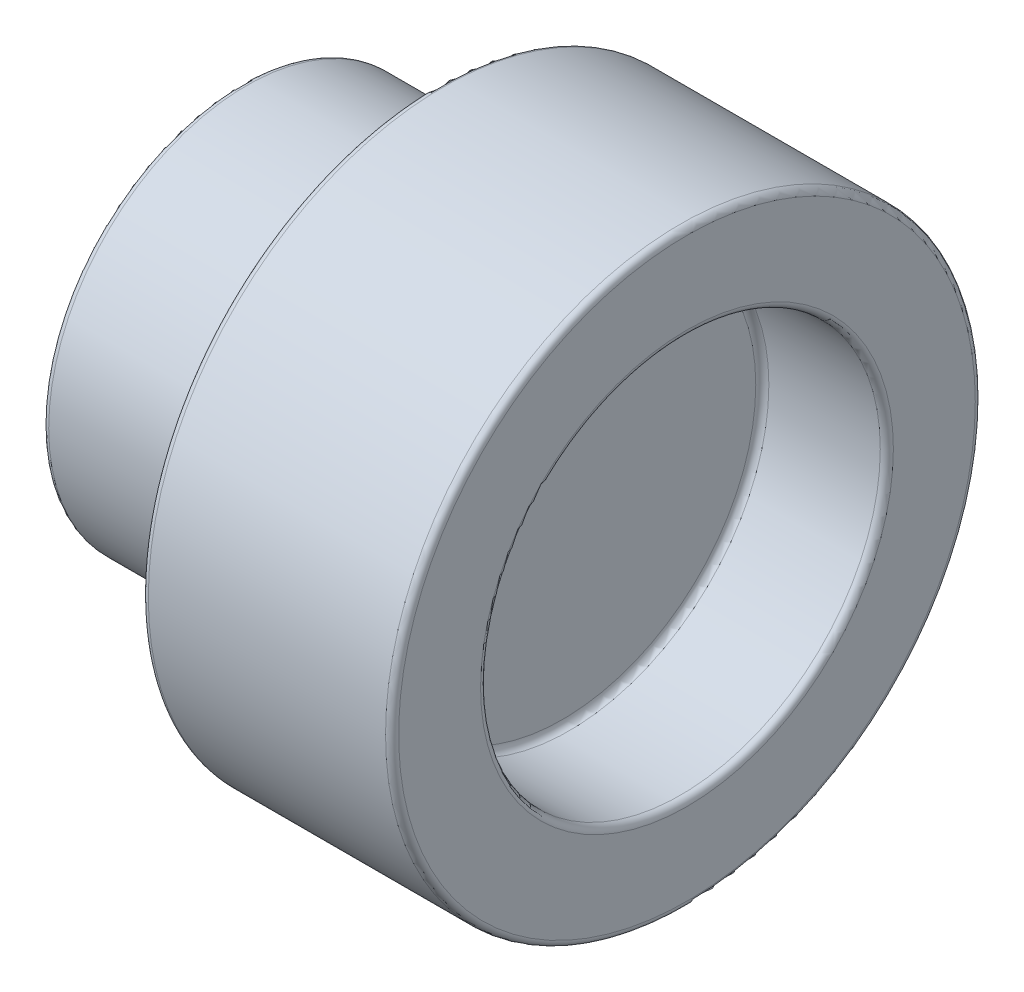
ISO-10303-21;
HEADER;
FILE_DESCRIPTION(('STEP AP214'),'2;1');
FILE_NAME('part.step','',(''),(''),'','','');
FILE_SCHEMA(('AUTOMOTIVE_DESIGN { 1 0 10303 214 1 1 1 1 }'));
ENDSEC;
DATA;
#1=APPLICATION_CONTEXT('core data for automotive mechanical design processes');
#2=APPLICATION_PROTOCOL_DEFINITION('international standard','automotive_design',2000,#1);
#3=PRODUCT_CONTEXT('',#1,'mechanical');
#4=PRODUCT('Part','Part','',(#3));
#5=PRODUCT_RELATED_PRODUCT_CATEGORY('part','',(#4));
#6=PRODUCT_DEFINITION_FORMATION('','',#4);
#7=PRODUCT_DEFINITION_CONTEXT('part definition',#1,'design');
#8=PRODUCT_DEFINITION('design','',#6,#7);
#9=PRODUCT_DEFINITION_SHAPE('','',#8);
#10=(LENGTH_UNIT() NAMED_UNIT(*) SI_UNIT(.MILLI.,.METRE.));
#11=(NAMED_UNIT(*) PLANE_ANGLE_UNIT() SI_UNIT($,.RADIAN.));
#12=(NAMED_UNIT(*) SI_UNIT($,.STERADIAN.) SOLID_ANGLE_UNIT());
#13=UNCERTAINTY_MEASURE_WITH_UNIT(LENGTH_MEASURE(1.E-05),#10,'distance_accuracy_value','');
#14=(GEOMETRIC_REPRESENTATION_CONTEXT(3) GLOBAL_UNCERTAINTY_ASSIGNED_CONTEXT((#13)) GLOBAL_UNIT_ASSIGNED_CONTEXT((#10,
#11,#12)) REPRESENTATION_CONTEXT('',''));
#15=CARTESIAN_POINT('',(0.,0.,0.));
#16=DIRECTION('',(0.,0.,1.));
#17=DIRECTION('',(1.,0.,0.));
#18=AXIS2_PLACEMENT_3D('',#15,#16,#17);
#19=CARTESIAN_POINT('',(3.82,0.,0.));
#20=DIRECTION('',(1.,0.,0.));
#21=DIRECTION('',(0.,0.,-1.));
#22=AXIS2_PLACEMENT_3D('',#19,#20,#21);
#23=PLANE('',#22);
#24=CARTESIAN_POINT('',(3.82,0.,0.));
#25=DIRECTION('',(1.,0.,0.));
#26=DIRECTION('',(0.,0.,-1.));
#27=AXIS2_PLACEMENT_3D('',#24,#25,#26);
#28=CIRCLE('',#27,3.15);
#29=CARTESIAN_POINT('',(3.82,0.,-3.15));
#30=VERTEX_POINT('',#29);
#31=EDGE_CURVE('E65',#30,#30,#28,.F.);
#32=ORIENTED_EDGE('',*,*,#31,.T.);
#33=EDGE_LOOP('',(#32));
#34=FACE_BOUND('',#33,.T.);
#35=CARTESIAN_POINT('',(3.82,0.,0.));
#36=DIRECTION('',(1.,0.,0.));
#37=DIRECTION('',(0.,0.,-1.));
#38=AXIS2_PLACEMENT_3D('',#35,#36,#37);
#39=CIRCLE('',#38,4.4);
#40=CARTESIAN_POINT('',(3.82,0.,-4.4));
#41=VERTEX_POINT('',#40);
#42=EDGE_CURVE('E68',#41,#41,#39,.T.);
#43=ORIENTED_EDGE('',*,*,#42,.T.);
#44=EDGE_LOOP('',(#43));
#45=FACE_BOUND('',#44,.T.);
#46=ADVANCED_FACE('F42',(#34,#45),#23,.T.);
#47=CARTESIAN_POINT('',(0.,0.,0.));
#48=DIRECTION('',(1.,0.,0.));
#49=DIRECTION('',(0.,0.,-1.));
#50=AXIS2_PLACEMENT_3D('',#47,#48,#49);
#51=PLANE('',#50);
#52=CARTESIAN_POINT('',(0.,0.,0.));
#53=DIRECTION('',(1.,0.,0.));
#54=DIRECTION('',(0.,0.,-1.));
#55=AXIS2_PLACEMENT_3D('',#52,#53,#54);
#56=CIRCLE('',#55,4.4);
#57=CARTESIAN_POINT('',(0.,0.,-4.4));
#58=VERTEX_POINT('',#57);
#59=EDGE_CURVE('E53',#58,#58,#56,.F.);
#60=ORIENTED_EDGE('',*,*,#59,.T.);
#61=EDGE_LOOP('',(#60));
#62=FACE_BOUND('',#61,.T.);
#63=CARTESIAN_POINT('',(0.,0.,0.));
#64=DIRECTION('',(1.,0.,0.));
#65=DIRECTION('',(0.,0.,-1.));
#66=AXIS2_PLACEMENT_3D('',#63,#64,#65);
#67=CIRCLE('',#66,3.05);
#68=CARTESIAN_POINT('',(0.,0.,-3.05));
#69=VERTEX_POINT('',#68);
#70=EDGE_CURVE('E83',#69,#69,#67,.F.);
#71=ORIENTED_EDGE('',*,*,#70,.F.);
#72=EDGE_LOOP('',(#71));
#73=FACE_BOUND('',#72,.T.);
#74=ADVANCED_FACE('F90',(#62,#73),#51,.F.);
#75=CARTESIAN_POINT('',(3.82,0.,0.));
#76=DIRECTION('',(-1.,0.,0.));
#77=DIRECTION('',(0.,0.,1.));
#78=AXIS2_PLACEMENT_3D('',#75,#76,#77);
#79=CYLINDRICAL_SURFACE('',#78,4.5);
#80=CARTESIAN_POINT('',(0.0999999999999998,0.,0.));
#81=DIRECTION('',(1.,0.,0.));
#82=DIRECTION('',(0.,0.,-1.));
#83=AXIS2_PLACEMENT_3D('',#80,#81,#82);
#84=CIRCLE('',#83,4.5);
#85=CARTESIAN_POINT('',(0.0999999999999994,0.,4.5));
#86=VERTEX_POINT('',#85);
#87=EDGE_CURVE('E57',#86,#86,#84,.T.);
#88=CARTESIAN_POINT('',(3.72,0.,0.));
#89=DIRECTION('',(1.,0.,0.));
#90=DIRECTION('',(0.,0.,-1.));
#91=AXIS2_PLACEMENT_3D('',#88,#89,#90);
#92=CIRCLE('',#91,4.5);
#93=CARTESIAN_POINT('',(3.72,0.,4.5));
#94=VERTEX_POINT('',#93);
#95=EDGE_CURVE('E62',#94,#94,#92,.F.);
#96=CARTESIAN_POINT('',(0.0999999999999994,0.,4.5));
#97=CARTESIAN_POINT('',(0.137708333333333,0.,4.5));
#98=CARTESIAN_POINT('',(0.175416666666666,0.,4.5));
#99=CARTESIAN_POINT('',(0.250833333333333,0.,4.5));
#100=CARTESIAN_POINT('',(0.288541666666666,0.,4.5));
#101=CARTESIAN_POINT('',(0.363958333333333,0.,4.5));
#102=CARTESIAN_POINT('',(0.401666666666666,0.,4.5));
#103=CARTESIAN_POINT('',(0.477083333333333,0.,4.5));
#104=CARTESIAN_POINT('',(0.514791666666666,0.,4.5));
#105=CARTESIAN_POINT('',(0.590208333333333,0.,4.5));
#106=CARTESIAN_POINT('',(0.627916666666666,0.,4.5));
#107=CARTESIAN_POINT('',(0.703333333333333,0.,4.5));
#108=CARTESIAN_POINT('',(0.741041666666666,0.,4.5));
#109=CARTESIAN_POINT('',(0.816458333333333,0.,4.5));
#110=CARTESIAN_POINT('',(0.854166666666666,0.,4.5));
#111=CARTESIAN_POINT('',(0.929583333333333,0.,4.5));
#112=CARTESIAN_POINT('',(0.967291666666666,0.,4.5));
#113=CARTESIAN_POINT('',(1.04270833333333,0.,4.5));
#114=CARTESIAN_POINT('',(1.08041666666667,0.,4.5));
#115=CARTESIAN_POINT('',(1.15583333333333,0.,4.5));
#116=CARTESIAN_POINT('',(1.19354166666667,0.,4.5));
#117=CARTESIAN_POINT('',(1.26895833333333,0.,4.5));
#118=CARTESIAN_POINT('',(1.30666666666667,0.,4.5));
#119=CARTESIAN_POINT('',(1.38208333333333,0.,4.5));
#120=CARTESIAN_POINT('',(1.41979166666667,0.,4.5));
#121=CARTESIAN_POINT('',(1.49520833333333,0.,4.5));
#122=CARTESIAN_POINT('',(1.53291666666667,0.,4.5));
#123=CARTESIAN_POINT('',(1.60833333333333,0.,4.5));
#124=CARTESIAN_POINT('',(1.64604166666667,0.,4.5));
#125=CARTESIAN_POINT('',(1.72145833333333,0.,4.5));
#126=CARTESIAN_POINT('',(1.75916666666667,0.,4.5));
#127=CARTESIAN_POINT('',(1.83458333333333,0.,4.5));
#128=CARTESIAN_POINT('',(1.87229166666667,0.,4.5));
#129=CARTESIAN_POINT('',(1.94770833333333,0.,4.5));
#130=CARTESIAN_POINT('',(1.98541666666667,0.,4.5));
#131=CARTESIAN_POINT('',(2.06083333333333,0.,4.5));
#132=CARTESIAN_POINT('',(2.09854166666667,0.,4.5));
#133=CARTESIAN_POINT('',(2.17395833333333,0.,4.5));
#134=CARTESIAN_POINT('',(2.21166666666667,0.,4.5));
#135=CARTESIAN_POINT('',(2.28708333333333,0.,4.5));
#136=CARTESIAN_POINT('',(2.32479166666667,0.,4.5));
#137=CARTESIAN_POINT('',(2.40020833333333,0.,4.5));
#138=CARTESIAN_POINT('',(2.43791666666667,0.,4.5));
#139=CARTESIAN_POINT('',(2.51333333333333,0.,4.5));
#140=CARTESIAN_POINT('',(2.55104166666667,0.,4.5));
#141=CARTESIAN_POINT('',(2.62645833333333,0.,4.5));
#142=CARTESIAN_POINT('',(2.66416666666667,0.,4.5));
#143=CARTESIAN_POINT('',(2.73958333333333,0.,4.5));
#144=CARTESIAN_POINT('',(2.77729166666667,0.,4.5));
#145=CARTESIAN_POINT('',(2.85270833333333,0.,4.5));
#146=CARTESIAN_POINT('',(2.89041666666667,0.,4.5));
#147=CARTESIAN_POINT('',(2.96583333333333,0.,4.5));
#148=CARTESIAN_POINT('',(3.00354166666667,0.,4.5));
#149=CARTESIAN_POINT('',(3.07895833333333,0.,4.5));
#150=CARTESIAN_POINT('',(3.11666666666667,0.,4.5));
#151=CARTESIAN_POINT('',(3.19208333333333,0.,4.5));
#152=CARTESIAN_POINT('',(3.22979166666667,0.,4.5));
#153=CARTESIAN_POINT('',(3.30520833333333,0.,4.5));
#154=CARTESIAN_POINT('',(3.34291666666667,0.,4.5));
#155=CARTESIAN_POINT('',(3.41833333333333,0.,4.5));
#156=CARTESIAN_POINT('',(3.45604166666667,0.,4.5));
#157=CARTESIAN_POINT('',(3.53145833333333,0.,4.5));
#158=CARTESIAN_POINT('',(3.56916666666667,0.,4.5));
#159=CARTESIAN_POINT('',(3.64458333333333,0.,4.5));
#160=CARTESIAN_POINT('',(3.68229166666667,0.,4.5));
#161=CARTESIAN_POINT('',(3.72,0.,4.5));
#162=B_SPLINE_CURVE_WITH_KNOTS('',3,(#96,#97,#98,#99,#100,#101,#102,#103,#104,#105,#106,#107,
#108,#109,#110,#111,#112,#113,#114,#115,#116,#117,#118,#119,#120,#121,#122,#123,#124,#125,#126,
#127,#128,#129,#130,#131,#132,#133,#134,#135,#136,#137,#138,#139,#140,#141,#142,#143,#144,#145,
#146,#147,#148,#149,#150,#151,#152,#153,#154,#155,#156,#157,#158,#159,#160,#161),.UNSPECIFIED.,
.F.,.F.,(4,2,2,2,2,2,2,2,2,2,2,2,2,2,2,2,2,2,2,2,2,2,2,2,2,2,2,2,2,2,2,2,4),(0.,0.113125,
0.22625,0.339375,0.4525,0.565625,0.67875,0.791875,0.905,1.018125,1.13125,1.244375,1.3575,
1.470625,1.58375,1.696875,1.81,1.923125,2.03625,2.149375,2.2625,2.375625,2.48875,2.601875,2.715,
2.828125,2.94125,3.054375,3.1675,3.280625,3.39375,3.506875,3.62),.UNSPECIFIED.);
#163=EDGE_CURVE('BSEAM92',#86,#94,#162,.T.);
#164=ORIENTED_EDGE('',*,*,#87,.T.);
#165=ORIENTED_EDGE('',*,*,#95,.T.);
#166=ORIENTED_EDGE('',*,*,#163,.T.);
#167=ORIENTED_EDGE('',*,*,#163,.F.);
#168=EDGE_LOOP('',(#164,#166,#165,#167));
#169=FACE_BOUND('',#168,.T.);
#170=ADVANCED_FACE('F92',(#169),#79,.T.);
#171=CARTESIAN_POINT('',(3.82,0.,0.));
#172=DIRECTION('',(-1.,0.,0.));
#173=DIRECTION('',(0.,0.,1.));
#174=AXIS2_PLACEMENT_3D('',#171,#172,#173);
#175=CYLINDRICAL_SURFACE('',#174,3.05);
#176=CARTESIAN_POINT('',(2.02,0.,0.));
#177=DIRECTION('',(1.,0.,0.));
#178=DIRECTION('',(0.,0.,-1.));
#179=AXIS2_PLACEMENT_3D('',#176,#177,#178);
#180=CIRCLE('',#179,3.05);
#181=CARTESIAN_POINT('',(2.02,0.,3.05));
#182=VERTEX_POINT('',#181);
#183=EDGE_CURVE('E11',#182,#182,#180,.F.);
#184=CARTESIAN_POINT('',(3.72,0.,0.));
#185=DIRECTION('',(1.,0.,0.));
#186=DIRECTION('',(0.,0.,-1.));
#187=AXIS2_PLACEMENT_3D('',#184,#185,#186);
#188=CIRCLE('',#187,3.05);
#189=CARTESIAN_POINT('',(3.72,0.,3.05));
#190=VERTEX_POINT('',#189);
#191=EDGE_CURVE('E71',#190,#190,#188,.T.);
#192=CARTESIAN_POINT('',(2.02,0.,3.05));
#193=CARTESIAN_POINT('',(2.03770833333333,0.,3.05));
#194=CARTESIAN_POINT('',(2.05541666666667,0.,3.05));
#195=CARTESIAN_POINT('',(2.09083333333333,0.,3.05));
#196=CARTESIAN_POINT('',(2.10854166666667,0.,3.05));
#197=CARTESIAN_POINT('',(2.14395833333333,0.,3.05));
#198=CARTESIAN_POINT('',(2.16166666666667,0.,3.05));
#199=CARTESIAN_POINT('',(2.19708333333333,0.,3.05));
#200=CARTESIAN_POINT('',(2.21479166666667,0.,3.05));
#201=CARTESIAN_POINT('',(2.25020833333333,0.,3.05));
#202=CARTESIAN_POINT('',(2.26791666666667,0.,3.05));
#203=CARTESIAN_POINT('',(2.30333333333333,0.,3.05));
#204=CARTESIAN_POINT('',(2.32104166666667,0.,3.05));
#205=CARTESIAN_POINT('',(2.35645833333333,0.,3.05));
#206=CARTESIAN_POINT('',(2.37416666666667,0.,3.05));
#207=CARTESIAN_POINT('',(2.40958333333333,0.,3.05));
#208=CARTESIAN_POINT('',(2.42729166666667,0.,3.05));
#209=CARTESIAN_POINT('',(2.46270833333333,0.,3.05));
#210=CARTESIAN_POINT('',(2.48041666666667,0.,3.05));
#211=CARTESIAN_POINT('',(2.51583333333333,0.,3.05));
#212=CARTESIAN_POINT('',(2.53354166666667,0.,3.05));
#213=CARTESIAN_POINT('',(2.56895833333333,0.,3.05));
#214=CARTESIAN_POINT('',(2.58666666666667,0.,3.05));
#215=CARTESIAN_POINT('',(2.62208333333333,0.,3.05));
#216=CARTESIAN_POINT('',(2.63979166666667,0.,3.05));
#217=CARTESIAN_POINT('',(2.67520833333333,0.,3.05));
#218=CARTESIAN_POINT('',(2.69291666666667,0.,3.05));
#219=CARTESIAN_POINT('',(2.72833333333333,0.,3.05));
#220=CARTESIAN_POINT('',(2.74604166666667,0.,3.05));
#221=CARTESIAN_POINT('',(2.78145833333333,0.,3.05));
#222=CARTESIAN_POINT('',(2.79916666666667,0.,3.05));
#223=CARTESIAN_POINT('',(2.83458333333333,0.,3.05));
#224=CARTESIAN_POINT('',(2.85229166666667,0.,3.05));
#225=CARTESIAN_POINT('',(2.88770833333333,0.,3.05));
#226=CARTESIAN_POINT('',(2.90541666666667,0.,3.05));
#227=CARTESIAN_POINT('',(2.94083333333333,0.,3.05));
#228=CARTESIAN_POINT('',(2.95854166666667,0.,3.05));
#229=CARTESIAN_POINT('',(2.99395833333333,0.,3.05));
#230=CARTESIAN_POINT('',(3.01166666666667,0.,3.05));
#231=CARTESIAN_POINT('',(3.04708333333333,0.,3.05));
#232=CARTESIAN_POINT('',(3.06479166666667,0.,3.05));
#233=CARTESIAN_POINT('',(3.10020833333333,0.,3.05));
#234=CARTESIAN_POINT('',(3.11791666666667,0.,3.05));
#235=CARTESIAN_POINT('',(3.15333333333333,0.,3.05));
#236=CARTESIAN_POINT('',(3.17104166666667,0.,3.05));
#237=CARTESIAN_POINT('',(3.20645833333333,0.,3.05));
#238=CARTESIAN_POINT('',(3.22416666666667,0.,3.05));
#239=CARTESIAN_POINT('',(3.25958333333333,0.,3.05));
#240=CARTESIAN_POINT('',(3.27729166666667,0.,3.05));
#241=CARTESIAN_POINT('',(3.31270833333333,0.,3.05));
#242=CARTESIAN_POINT('',(3.33041666666667,0.,3.05));
#243=CARTESIAN_POINT('',(3.36583333333333,0.,3.05));
#244=CARTESIAN_POINT('',(3.38354166666667,0.,3.05));
#245=CARTESIAN_POINT('',(3.41895833333333,0.,3.05));
#246=CARTESIAN_POINT('',(3.43666666666667,0.,3.05));
#247=CARTESIAN_POINT('',(3.47208333333333,0.,3.05));
#248=CARTESIAN_POINT('',(3.48979166666667,0.,3.05));
#249=CARTESIAN_POINT('',(3.52520833333333,0.,3.05));
#250=CARTESIAN_POINT('',(3.54291666666667,0.,3.05));
#251=CARTESIAN_POINT('',(3.57833333333333,0.,3.05));
#252=CARTESIAN_POINT('',(3.59604166666667,0.,3.05));
#253=CARTESIAN_POINT('',(3.63145833333333,0.,3.05));
#254=CARTESIAN_POINT('',(3.64916666666667,0.,3.05));
#255=CARTESIAN_POINT('',(3.68458333333333,0.,3.05));
#256=CARTESIAN_POINT('',(3.70229166666667,0.,3.05));
#257=CARTESIAN_POINT('',(3.72,0.,3.05));
#258=B_SPLINE_CURVE_WITH_KNOTS('',3,(#192,#193,#194,#195,#196,#197,#198,#199,#200,#201,#202,
#203,#204,#205,#206,#207,#208,#209,#210,#211,#212,#213,#214,#215,#216,#217,#218,#219,#220,#221,
#222,#223,#224,#225,#226,#227,#228,#229,#230,#231,#232,#233,#234,#235,#236,#237,#238,#239,#240,
#241,#242,#243,#244,#245,#246,#247,#248,#249,#250,#251,#252,#253,#254,#255,#256,#257),
.UNSPECIFIED.,.F.,.F.,(4,2,2,2,2,2,2,2,2,2,2,2,2,2,2,2,2,2,2,2,2,2,2,2,2,2,2,2,2,2,2,2,4),(0.,
0.0531249999999998,0.10625,0.159375,0.2125,0.265625,0.31875,0.371875,0.425,0.478125,0.53125,
0.584375,0.6375,0.690625,0.74375,0.796875,0.85,0.903125,0.95625,1.009375,1.0625,1.115625,
1.16875,1.221875,1.275,1.328125,1.38125,1.434375,1.4875,1.540625,1.59375,1.646875,1.7),.UNSPECIFIED.);
#259=EDGE_CURVE('BSEAM99',#182,#190,#258,.T.);
#260=ORIENTED_EDGE('',*,*,#183,.T.);
#261=ORIENTED_EDGE('',*,*,#191,.T.);
#262=ORIENTED_EDGE('',*,*,#259,.T.);
#263=ORIENTED_EDGE('',*,*,#259,.F.);
#264=EDGE_LOOP('',(#260,#262,#261,#263));
#265=FACE_BOUND('',#264,.T.);
#266=ADVANCED_FACE('F99',(#265),#175,.F.);
#267=CARTESIAN_POINT('',(3.72,0.,0.));
#268=DIRECTION('',(1.,0.,0.));
#269=DIRECTION('',(0.,0.,-1.));
#270=AXIS2_PLACEMENT_3D('',#267,#268,#269);
#271=TOROIDAL_SURFACE('',#270,3.15,0.1);
#272=ORIENTED_EDGE('',*,*,#31,.F.);
#273=EDGE_LOOP('',(#272));
#274=FACE_BOUND('',#273,.T.);
#275=ORIENTED_EDGE('',*,*,#191,.F.);
#276=EDGE_LOOP('',(#275));
#277=FACE_BOUND('',#276,.T.);
#278=ADVANCED_FACE('F106',(#274,#277),#271,.T.);
#279=CARTESIAN_POINT('',(0.0999999999999998,0.,0.));
#280=DIRECTION('',(1.,0.,0.));
#281=DIRECTION('',(0.,0.,-1.));
#282=AXIS2_PLACEMENT_3D('',#279,#280,#281);
#283=TOROIDAL_SURFACE('',#282,4.4,0.1);
#284=ORIENTED_EDGE('',*,*,#59,.F.);
#285=EDGE_LOOP('',(#284));
#286=FACE_BOUND('',#285,.T.);
#287=ORIENTED_EDGE('',*,*,#87,.F.);
#288=EDGE_LOOP('',(#287));
#289=FACE_BOUND('',#288,.T.);
#290=ADVANCED_FACE('F109',(#286,#289),#283,.T.);
#291=CARTESIAN_POINT('',(3.72,0.,0.));
#292=DIRECTION('',(1.,0.,0.));
#293=DIRECTION('',(0.,0.,-1.));
#294=AXIS2_PLACEMENT_3D('',#291,#292,#293);
#295=TOROIDAL_SURFACE('',#294,4.4,0.1);
#296=ORIENTED_EDGE('',*,*,#95,.F.);
#297=EDGE_LOOP('',(#296));
#298=FACE_BOUND('',#297,.T.);
#299=ORIENTED_EDGE('',*,*,#42,.F.);
#300=EDGE_LOOP('',(#299));
#301=FACE_BOUND('',#300,.T.);
#302=ADVANCED_FACE('F112',(#298,#301),#295,.T.);
#303=CARTESIAN_POINT('',(-0.0714142842854287,0.,0.));
#304=DIRECTION('',(1.,0.,0.));
#305=DIRECTION('',(0.,0.,-1.));
#306=AXIS2_PLACEMENT_3D('',#303,#304,#305);
#307=TOROIDAL_SURFACE('',#306,3.12,0.1);
#308=ORIENTED_EDGE('',*,*,#70,.T.);
#309=EDGE_LOOP('',(#308));
#310=FACE_BOUND('',#309,.T.);
#311=CARTESIAN_POINT('',(-0.0714142842854291,0.,0.));
#312=DIRECTION('',(1.,0.,0.));
#313=DIRECTION('',(0.,0.,-1.));
#314=AXIS2_PLACEMENT_3D('',#311,#312,#313);
#315=CIRCLE('',#314,3.02);
#316=CARTESIAN_POINT('',(-0.0714142842854291,0.,-3.02));
#317=VERTEX_POINT('',#316);
#318=EDGE_CURVE('E74',#317,#317,#315,.F.);
#319=ORIENTED_EDGE('',*,*,#318,.F.);
#320=EDGE_LOOP('',(#319));
#321=FACE_BOUND('',#320,.T.);
#322=ADVANCED_FACE('F87',(#310,#321),#307,.F.);
#323=CARTESIAN_POINT('',(-2.9,0.,0.));
#324=DIRECTION('',(-1.,0.,0.));
#325=DIRECTION('',(0.,0.,1.));
#326=AXIS2_PLACEMENT_3D('',#323,#324,#325);
#327=TOROIDAL_SURFACE('',#326,2.92,0.1);
#328=CARTESIAN_POINT('',(-2.9,0.,0.));
#329=DIRECTION('',(-1.,0.,0.));
#330=DIRECTION('',(0.,0.,1.));
#331=AXIS2_PLACEMENT_3D('',#328,#329,#330);
#332=CIRCLE('',#331,3.02);
#333=CARTESIAN_POINT('',(-2.9,0.,3.02));
#334=VERTEX_POINT('',#333);
#335=EDGE_CURVE('E77',#334,#334,#332,.F.);
#336=ORIENTED_EDGE('',*,*,#335,.F.);
#337=EDGE_LOOP('',(#336));
#338=FACE_BOUND('',#337,.T.);
#339=CARTESIAN_POINT('',(-3.,0.,0.));
#340=DIRECTION('',(-1.,0.,0.));
#341=DIRECTION('',(0.,0.,1.));
#342=AXIS2_PLACEMENT_3D('',#339,#340,#341);
#343=CIRCLE('',#342,2.92);
#344=CARTESIAN_POINT('',(-3.,0.,2.92));
#345=VERTEX_POINT('',#344);
#346=EDGE_CURVE('E80',#345,#345,#343,.T.);
#347=ORIENTED_EDGE('',*,*,#346,.F.);
#348=EDGE_LOOP('',(#347));
#349=FACE_BOUND('',#348,.T.);
#350=ADVANCED_FACE('F119',(#338,#349),#327,.T.);
#351=CARTESIAN_POINT('',(-3.,0.,0.));
#352=DIRECTION('',(-1.,0.,0.));
#353=DIRECTION('',(0.,0.,1.));
#354=AXIS2_PLACEMENT_3D('',#351,#352,#353);
#355=PLANE('',#354);
#356=ORIENTED_EDGE('',*,*,#346,.T.);
#357=EDGE_LOOP('',(#356));
#358=FACE_BOUND('',#357,.T.);
#359=ADVANCED_FACE('F129',(#358),#355,.T.);
#360=CARTESIAN_POINT('',(8.62670273047588,0.,0.));
#361=DIRECTION('',(-1.,0.,0.));
#362=DIRECTION('',(0.,0.,1.));
#363=AXIS2_PLACEMENT_3D('',#360,#361,#362);
#364=CYLINDRICAL_SURFACE('',#363,3.02);
#365=ORIENTED_EDGE('',*,*,#318,.T.);
#366=EDGE_LOOP('',(#365));
#367=FACE_BOUND('',#366,.T.);
#368=ORIENTED_EDGE('',*,*,#335,.T.);
#369=EDGE_LOOP('',(#368));
#370=FACE_BOUND('',#369,.T.);
#371=ADVANCED_FACE('F172',(#367,#370),#364,.T.);
#372=CARTESIAN_POINT('',(1.92,0.,0.));
#373=DIRECTION('',(1.,0.,0.));
#374=DIRECTION('',(0.,0.,-1.));
#375=AXIS2_PLACEMENT_3D('',#372,#373,#374);
#376=PLANE('',#375);
#377=CARTESIAN_POINT('',(1.92,0.,0.));
#378=DIRECTION('',(1.,0.,0.));
#379=DIRECTION('',(0.,0.,-1.));
#380=AXIS2_PLACEMENT_3D('',#377,#378,#379);
#381=CIRCLE('',#380,2.95);
#382=CARTESIAN_POINT('',(1.92,0.,-2.95));
#383=VERTEX_POINT('',#382);
#384=EDGE_CURVE('E49',#383,#383,#381,.T.);
#385=ORIENTED_EDGE('',*,*,#384,.T.);
#386=EDGE_LOOP('',(#385));
#387=FACE_BOUND('',#386,.T.);
#388=ADVANCED_FACE('F167',(#387),#376,.T.);
#389=CARTESIAN_POINT('',(2.02,0.,0.));
#390=DIRECTION('',(1.,0.,0.));
#391=DIRECTION('',(0.,0.,-1.));
#392=AXIS2_PLACEMENT_3D('',#389,#390,#391);
#393=TOROIDAL_SURFACE('',#392,2.95,0.1);
#394=ORIENTED_EDGE('',*,*,#183,.F.);
#395=EDGE_LOOP('',(#394));
#396=FACE_BOUND('',#395,.T.);
#397=ORIENTED_EDGE('',*,*,#384,.F.);
#398=EDGE_LOOP('',(#397));
#399=FACE_BOUND('',#398,.T.);
#400=ADVANCED_FACE('F44',(#396,#399),#393,.F.);
#401=CLOSED_SHELL('',(#46,#74,#170,#266,#278,#290,#302,#322,#350,#359,#371,#388,#400));
#402=MANIFOLD_SOLID_BREP('B2',#401);
#403=ADVANCED_BREP_SHAPE_REPRESENTATION('',(#18,#402),#14);
#404=SHAPE_DEFINITION_REPRESENTATION(#9,#403);
ENDSEC;
END-ISO-10303-21;
